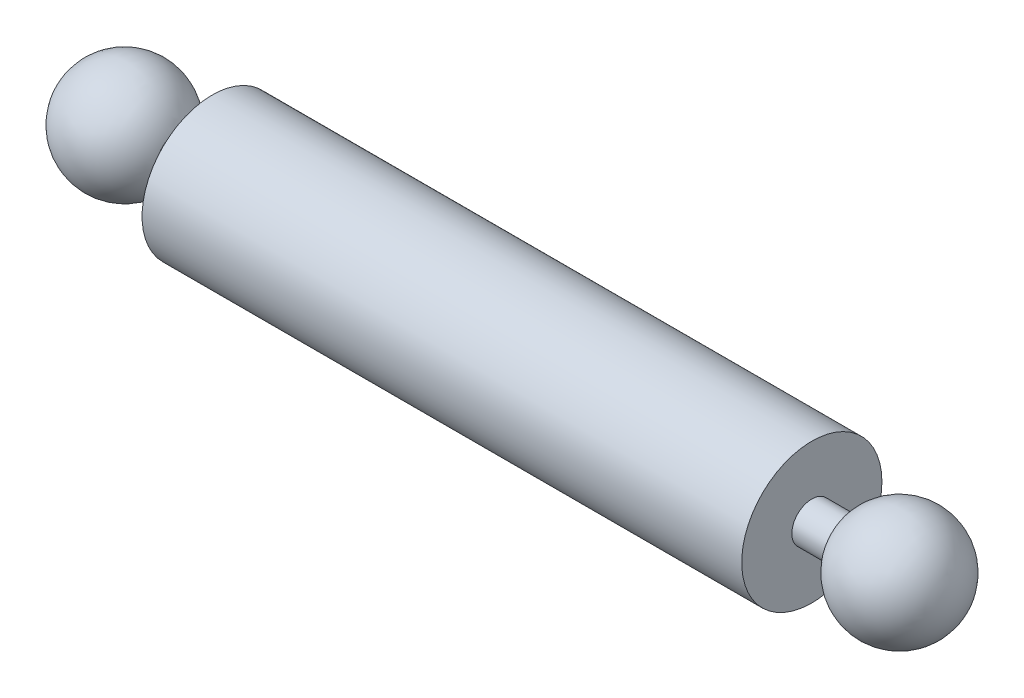
ISO-10303-21;
HEADER;
FILE_DESCRIPTION(('STEP AP214'),'2;1');
FILE_NAME('part.step','',(''),(''),'','','');
FILE_SCHEMA(('AUTOMOTIVE_DESIGN { 1 0 10303 214 1 1 1 1 }'));
ENDSEC;
DATA;
#1=APPLICATION_CONTEXT('core data for automotive mechanical design processes');
#2=APPLICATION_PROTOCOL_DEFINITION('international standard','automotive_design',2000,#1);
#3=PRODUCT_CONTEXT('',#1,'mechanical');
#4=PRODUCT('Part','Part','',(#3));
#5=PRODUCT_RELATED_PRODUCT_CATEGORY('part','',(#4));
#6=PRODUCT_DEFINITION_FORMATION('','',#4);
#7=PRODUCT_DEFINITION_CONTEXT('part definition',#1,'design');
#8=PRODUCT_DEFINITION('design','',#6,#7);
#9=PRODUCT_DEFINITION_SHAPE('','',#8);
#10=(LENGTH_UNIT() NAMED_UNIT(*) SI_UNIT(.MILLI.,.METRE.));
#11=(NAMED_UNIT(*) PLANE_ANGLE_UNIT() SI_UNIT($,.RADIAN.));
#12=(NAMED_UNIT(*) SI_UNIT($,.STERADIAN.) SOLID_ANGLE_UNIT());
#13=UNCERTAINTY_MEASURE_WITH_UNIT(LENGTH_MEASURE(1.E-05),#10,'distance_accuracy_value','');
#14=(GEOMETRIC_REPRESENTATION_CONTEXT(3) GLOBAL_UNCERTAINTY_ASSIGNED_CONTEXT((#13)) GLOBAL_UNIT_ASSIGNED_CONTEXT((#10,
#11,#12)) REPRESENTATION_CONTEXT('',''));
#15=CARTESIAN_POINT('',(0.,0.,0.));
#16=DIRECTION('',(0.,0.,1.));
#17=DIRECTION('',(1.,0.,0.));
#18=AXIS2_PLACEMENT_3D('',#15,#16,#17);
#19=CARTESIAN_POINT('',(26.9875,0.,0.));
#20=DIRECTION('',(-1.,0.,0.));
#21=DIRECTION('',(0.,0.,1.));
#22=AXIS2_PLACEMENT_3D('',#19,#20,#21);
#23=CYLINDRICAL_SURFACE('',#22,1.5875);
#24=CARTESIAN_POINT('',(23.8125,0.,0.));
#25=DIRECTION('',(-1.,0.,0.));
#26=DIRECTION('',(0.,0.,1.));
#27=AXIS2_PLACEMENT_3D('',#24,#25,#26);
#28=CIRCLE('',#27,1.5875);
#29=CARTESIAN_POINT('',(23.8125,0.,1.5875));
#30=VERTEX_POINT('',#29);
#31=EDGE_CURVE('E59',#30,#30,#28,.T.);
#32=ORIENTED_EDGE('',*,*,#31,.F.);
#33=EDGE_LOOP('',(#32));
#34=FACE_BOUND('',#33,.T.);
#35=CARTESIAN_POINT('',(26.6474536018223,0.,0.));
#36=DIRECTION('',(1.,0.,0.));
#37=DIRECTION('',(0.,0.,-1.));
#38=AXIS2_PLACEMENT_3D('',#35,#36,#37);
#39=CIRCLE('',#38,1.5875);
#40=CARTESIAN_POINT('',(26.6474536018223,0.,-1.5875));
#41=VERTEX_POINT('',#40);
#42=EDGE_CURVE('E41',#41,#41,#39,.F.);
#43=ORIENTED_EDGE('',*,*,#42,.T.);
#44=EDGE_LOOP('',(#43));
#45=FACE_BOUND('',#44,.T.);
#46=ADVANCED_FACE('F37',(#34,#45),#23,.T.);
#47=CARTESIAN_POINT('',(-26.9875,0.,0.));
#48=DIRECTION('',(1.,0.,0.));
#49=DIRECTION('',(0.,0.,-1.));
#50=AXIS2_PLACEMENT_3D('',#47,#48,#49);
#51=CYLINDRICAL_SURFACE('',#50,1.5875);
#52=CARTESIAN_POINT('',(-23.8125,0.,0.));
#53=DIRECTION('',(-1.,0.,0.));
#54=DIRECTION('',(0.,0.,1.));
#55=AXIS2_PLACEMENT_3D('',#52,#53,#54);
#56=CIRCLE('',#55,1.5875);
#57=CARTESIAN_POINT('',(-23.8125,0.,1.5875));
#58=VERTEX_POINT('',#57);
#59=EDGE_CURVE('E46',#58,#58,#56,.T.);
#60=ORIENTED_EDGE('',*,*,#59,.T.);
#61=EDGE_LOOP('',(#60));
#62=FACE_BOUND('',#61,.T.);
#63=CARTESIAN_POINT('',(-26.6474536018223,0.,0.));
#64=DIRECTION('',(-1.,0.,0.));
#65=DIRECTION('',(0.,0.,1.));
#66=AXIS2_PLACEMENT_3D('',#63,#64,#65);
#67=CIRCLE('',#66,1.5875);
#68=CARTESIAN_POINT('',(-26.6474536018223,0.,1.5875));
#69=VERTEX_POINT('',#68);
#70=EDGE_CURVE('E10',#69,#69,#67,.T.);
#71=ORIENTED_EDGE('',*,*,#70,.F.);
#72=EDGE_LOOP('',(#71));
#73=FACE_BOUND('',#72,.T.);
#74=ADVANCED_FACE('F85',(#62,#73),#51,.T.);
#75=CARTESIAN_POINT('',(-23.8125,0.,0.));
#76=DIRECTION('',(1.,0.,0.));
#77=DIRECTION('',(0.,0.,-1.));
#78=AXIS2_PLACEMENT_3D('',#75,#76,#77);
#79=CYLINDRICAL_SURFACE('',#78,5.56895);
#80=CARTESIAN_POINT('',(-23.8125,0.,0.));
#81=DIRECTION('',(1.,0.,0.));
#82=DIRECTION('',(0.,0.,-1.));
#83=AXIS2_PLACEMENT_3D('',#80,#81,#82);
#84=CIRCLE('',#83,5.56895);
#85=CARTESIAN_POINT('',(-23.8125,0.,-5.56895));
#86=VERTEX_POINT('',#85);
#87=EDGE_CURVE('E52',#86,#86,#84,.T.);
#88=ORIENTED_EDGE('',*,*,#87,.T.);
#89=EDGE_LOOP('',(#88));
#90=FACE_BOUND('',#89,.T.);
#91=CARTESIAN_POINT('',(23.8125,0.,0.));
#92=DIRECTION('',(1.,0.,0.));
#93=DIRECTION('',(0.,0.,-1.));
#94=AXIS2_PLACEMENT_3D('',#91,#92,#93);
#95=CIRCLE('',#94,5.56895);
#96=CARTESIAN_POINT('',(23.8125,0.,-5.56895));
#97=VERTEX_POINT('',#96);
#98=EDGE_CURVE('E55',#97,#97,#95,.T.);
#99=ORIENTED_EDGE('',*,*,#98,.F.);
#100=EDGE_LOOP('',(#99));
#101=FACE_BOUND('',#100,.T.);
#102=ADVANCED_FACE('F39',(#90,#101),#79,.T.);
#103=CARTESIAN_POINT('',(-23.8125,0.,0.));
#104=DIRECTION('',(1.,0.,0.));
#105=DIRECTION('',(0.,0.,-1.));
#106=AXIS2_PLACEMENT_3D('',#103,#104,#105);
#107=PLANE('',#106);
#108=ORIENTED_EDGE('',*,*,#59,.F.);
#109=EDGE_LOOP('',(#108));
#110=FACE_BOUND('',#109,.T.);
#111=ORIENTED_EDGE('',*,*,#87,.F.);
#112=EDGE_LOOP('',(#111));
#113=FACE_BOUND('',#112,.T.);
#114=ADVANCED_FACE('F93',(#110,#113),#107,.F.);
#115=CARTESIAN_POINT('',(23.8125,0.,0.));
#116=DIRECTION('',(1.,0.,0.));
#117=DIRECTION('',(0.,0.,-1.));
#118=AXIS2_PLACEMENT_3D('',#115,#116,#117);
#119=PLANE('',#118);
#120=ORIENTED_EDGE('',*,*,#31,.T.);
#121=EDGE_LOOP('',(#120));
#122=FACE_BOUND('',#121,.T.);
#123=ORIENTED_EDGE('',*,*,#98,.T.);
#124=EDGE_LOOP('',(#123));
#125=FACE_BOUND('',#124,.T.);
#126=ADVANCED_FACE('F81',(#122,#125),#119,.T.);
#127=CARTESIAN_POINT('',(-30.7721,0.,0.));
#128=DIRECTION('',(-1.,0.,0.));
#129=DIRECTION('',(0.,1.,0.));
#130=AXIS2_PLACEMENT_3D('',#127,#128,#129);
#131=SPHERICAL_SURFACE('',#130,4.4196);
#132=ORIENTED_EDGE('',*,*,#70,.T.);
#133=EDGE_LOOP('',(#132));
#134=FACE_BOUND('',#133,.T.);
#135=ADVANCED_FACE('F76',(#134),#131,.T.);
#136=CARTESIAN_POINT('',(30.7721,0.,0.));
#137=DIRECTION('',(1.,0.,0.));
#138=DIRECTION('',(0.,1.,0.));
#139=AXIS2_PLACEMENT_3D('',#136,#137,#138);
#140=SPHERICAL_SURFACE('',#139,4.4196);
#141=ORIENTED_EDGE('',*,*,#42,.F.);
#142=EDGE_LOOP('',(#141));
#143=FACE_BOUND('',#142,.T.);
#144=ADVANCED_FACE('F74',(#143),#140,.T.);
#145=CLOSED_SHELL('',(#46,#74,#102,#114,#126,#135,#144));
#146=MANIFOLD_SOLID_BREP('B2',#145);
#147=ADVANCED_BREP_SHAPE_REPRESENTATION('',(#18,#146),#14);
#148=SHAPE_DEFINITION_REPRESENTATION(#9,#147);
ENDSEC;
END-ISO-10303-21;
